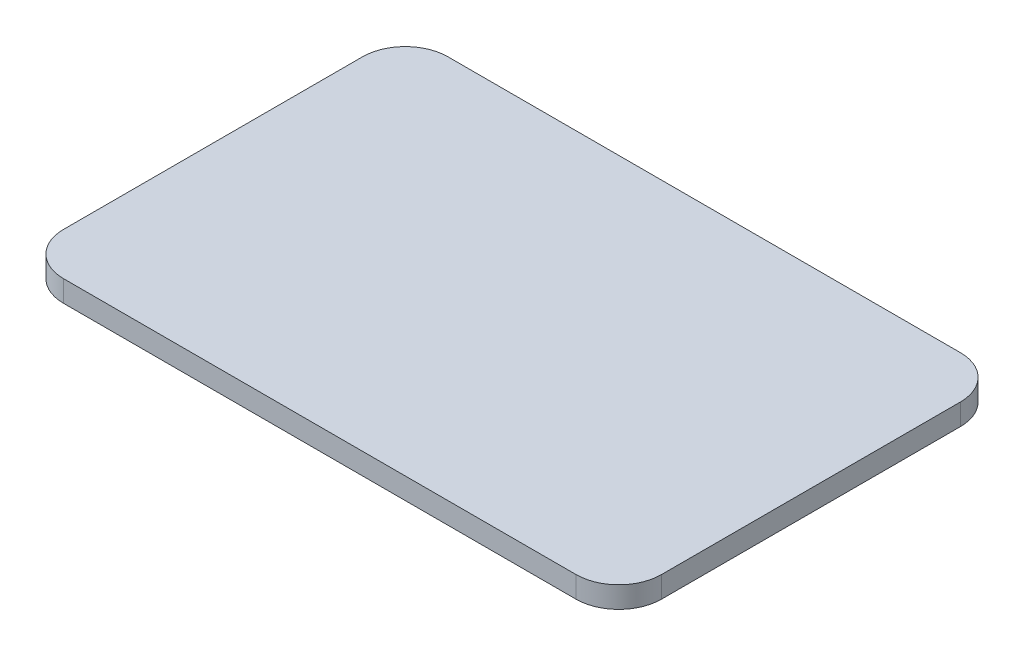
ISO-10303-21;
HEADER;
FILE_DESCRIPTION(('STEP AP214'),'2;1');
FILE_NAME('part.step','',(''),(''),'','','');
FILE_SCHEMA(('AUTOMOTIVE_DESIGN { 1 0 10303 214 1 1 1 1 }'));
ENDSEC;
DATA;
#1=APPLICATION_CONTEXT('core data for automotive mechanical design processes');
#2=APPLICATION_PROTOCOL_DEFINITION('international standard','automotive_design',2000,#1);
#3=PRODUCT_CONTEXT('',#1,'mechanical');
#4=PRODUCT('Part','Part','',(#3));
#5=PRODUCT_RELATED_PRODUCT_CATEGORY('part','',(#4));
#6=PRODUCT_DEFINITION_FORMATION('','',#4);
#7=PRODUCT_DEFINITION_CONTEXT('part definition',#1,'design');
#8=PRODUCT_DEFINITION('design','',#6,#7);
#9=PRODUCT_DEFINITION_SHAPE('','',#8);
#10=(LENGTH_UNIT() NAMED_UNIT(*) SI_UNIT(.MILLI.,.METRE.));
#11=(NAMED_UNIT(*) PLANE_ANGLE_UNIT() SI_UNIT($,.RADIAN.));
#12=(NAMED_UNIT(*) SI_UNIT($,.STERADIAN.) SOLID_ANGLE_UNIT());
#13=UNCERTAINTY_MEASURE_WITH_UNIT(LENGTH_MEASURE(1.E-05),#10,'distance_accuracy_value','');
#14=(GEOMETRIC_REPRESENTATION_CONTEXT(3) GLOBAL_UNCERTAINTY_ASSIGNED_CONTEXT((#13)) GLOBAL_UNIT_ASSIGNED_CONTEXT((#10,
#11,#12)) REPRESENTATION_CONTEXT('',''));
#15=CARTESIAN_POINT('',(0.,0.,0.));
#16=DIRECTION('',(0.,0.,1.));
#17=DIRECTION('',(1.,0.,0.));
#18=AXIS2_PLACEMENT_3D('',#15,#16,#17);
#19=CARTESIAN_POINT('',(-50.1375515818432,5.,-51.0660247592847));
#20=DIRECTION('',(1.,0.,0.));
#21=DIRECTION('',(0.,0.,-1.));
#22=AXIS2_PLACEMENT_3D('',#19,#20,#21);
#23=PLANE('',#22);
#24=DIRECTION('',(0.,0.,1.));
#25=VECTOR('',#24,1.);
#26=CARTESIAN_POINT('',(-50.1375515818432,5.,-51.0660247592847));
#27=LINE('',#26,#25);
#28=CARTESIAN_POINT('',(-50.1375515818432,5.,-41.0660247592847));
#29=VERTEX_POINT('',#28);
#30=CARTESIAN_POINT('',(-50.1375515818432,5.,28.9339752407152));
#31=VERTEX_POINT('',#30);
#32=EDGE_CURVE('E123',#29,#31,#27,.T.);
#33=ORIENTED_EDGE('',*,*,#32,.F.);
#34=DIRECTION('',(0.,-1.,0.));
#35=VECTOR('',#34,1.);
#36=CARTESIAN_POINT('',(-50.1375515818432,5.,-41.0660247592847));
#37=LINE('',#36,#35);
#38=CARTESIAN_POINT('',(-50.1375515818432,0.,-41.0660247592847));
#39=VERTEX_POINT('',#38);
#40=EDGE_CURVE('E108',#29,#39,#37,.T.);
#41=ORIENTED_EDGE('',*,*,#40,.T.);
#42=DIRECTION('',(0.,0.,1.));
#43=VECTOR('',#42,1.);
#44=CARTESIAN_POINT('',(-50.1375515818432,0.,-51.0660247592847));
#45=LINE('',#44,#43);
#46=CARTESIAN_POINT('',(-50.1375515818432,0.,28.9339752407152));
#47=VERTEX_POINT('',#46);
#48=EDGE_CURVE('E120',#39,#47,#45,.T.);
#49=ORIENTED_EDGE('',*,*,#48,.T.);
#50=DIRECTION('',(0.,-1.,0.));
#51=VECTOR('',#50,1.);
#52=CARTESIAN_POINT('',(-50.1375515818432,5.,28.9339752407153));
#53=LINE('',#52,#51);
#54=EDGE_CURVE('E125',#47,#31,#53,.F.);
#55=ORIENTED_EDGE('',*,*,#54,.T.);
#56=EDGE_LOOP('',(#33,#41,#49,#55));
#57=FACE_BOUND('',#56,.T.);
#58=ADVANCED_FACE('F38',(#57),#23,.F.);
#59=CARTESIAN_POINT('',(-50.1375515818432,5.,38.9339752407153));
#60=DIRECTION('',(0.,0.,-1.));
#61=DIRECTION('',(-1.,0.,0.));
#62=AXIS2_PLACEMENT_3D('',#59,#60,#61);
#63=PLANE('',#62);
#64=DIRECTION('',(1.,0.,0.));
#65=VECTOR('',#64,1.);
#66=CARTESIAN_POINT('',(-50.1375515818432,0.,38.9339752407153));
#67=LINE('',#66,#65);
#68=CARTESIAN_POINT('',(-40.1375515818432,0.,38.9339752407153));
#69=VERTEX_POINT('',#68);
#70=CARTESIAN_POINT('',(79.8624484181568,0.,38.9339752407153));
#71=VERTEX_POINT('',#70);
#72=EDGE_CURVE('E130',#69,#71,#67,.T.);
#73=ORIENTED_EDGE('',*,*,#72,.T.);
#74=DIRECTION('',(0.,-1.,0.));
#75=VECTOR('',#74,1.);
#76=CARTESIAN_POINT('',(79.8624484181568,5.,38.9339752407153));
#77=LINE('',#76,#75);
#78=CARTESIAN_POINT('',(79.8624484181568,5.,38.9339752407153));
#79=VERTEX_POINT('',#78);
#80=EDGE_CURVE('E11',#71,#79,#77,.F.);
#81=ORIENTED_EDGE('',*,*,#80,.T.);
#82=DIRECTION('',(1.,0.,0.));
#83=VECTOR('',#82,1.);
#84=CARTESIAN_POINT('',(-50.1375515818432,5.,38.9339752407153));
#85=LINE('',#84,#83);
#86=CARTESIAN_POINT('',(-40.1375515818432,5.,38.9339752407153));
#87=VERTEX_POINT('',#86);
#88=EDGE_CURVE('E165',#87,#79,#85,.T.);
#89=ORIENTED_EDGE('',*,*,#88,.F.);
#90=DIRECTION('',(0.,-1.,0.));
#91=VECTOR('',#90,1.);
#92=CARTESIAN_POINT('',(-40.1375515818432,5.,38.9339752407153));
#93=LINE('',#92,#91);
#94=EDGE_CURVE('E46',#87,#69,#93,.T.);
#95=ORIENTED_EDGE('',*,*,#94,.T.);
#96=EDGE_LOOP('',(#73,#81,#89,#95));
#97=FACE_BOUND('',#96,.T.);
#98=ADVANCED_FACE('F163',(#97),#63,.F.);
#99=CARTESIAN_POINT('',(89.8624484181568,5.,-51.0660247592847));
#100=DIRECTION('',(-1.,0.,0.));
#101=DIRECTION('',(0.,0.,1.));
#102=AXIS2_PLACEMENT_3D('',#99,#100,#101);
#103=PLANE('',#102);
#104=DIRECTION('',(0.,0.,-1.));
#105=VECTOR('',#104,1.);
#106=CARTESIAN_POINT('',(89.8624484181568,5.,-51.0660247592847));
#107=LINE('',#106,#105);
#108=CARTESIAN_POINT('',(89.8624484181568,5.,28.9339752407152));
#109=VERTEX_POINT('',#108);
#110=CARTESIAN_POINT('',(89.8624484181568,5.,-41.0660247592847));
#111=VERTEX_POINT('',#110);
#112=EDGE_CURVE('E173',#109,#111,#107,.T.);
#113=ORIENTED_EDGE('',*,*,#112,.F.);
#114=DIRECTION('',(0.,-1.,0.));
#115=VECTOR('',#114,1.);
#116=CARTESIAN_POINT('',(89.8624484181568,5.,28.9339752407153));
#117=LINE('',#116,#115);
#118=CARTESIAN_POINT('',(89.8624484181568,0.,28.9339752407152));
#119=VERTEX_POINT('',#118);
#120=EDGE_CURVE('E157',#109,#119,#117,.T.);
#121=ORIENTED_EDGE('',*,*,#120,.T.);
#122=DIRECTION('',(0.,0.,-1.));
#123=VECTOR('',#122,1.);
#124=CARTESIAN_POINT('',(89.8624484181568,0.,-51.0660247592847));
#125=LINE('',#124,#123);
#126=CARTESIAN_POINT('',(89.8624484181568,0.,-41.0660247592847));
#127=VERTEX_POINT('',#126);
#128=EDGE_CURVE('E133',#119,#127,#125,.T.);
#129=ORIENTED_EDGE('',*,*,#128,.T.);
#130=DIRECTION('',(0.,-1.,0.));
#131=VECTOR('',#130,1.);
#132=CARTESIAN_POINT('',(89.8624484181568,5.,-41.0660247592847));
#133=LINE('',#132,#131);
#134=EDGE_CURVE('E53',#127,#111,#133,.F.);
#135=ORIENTED_EDGE('',*,*,#134,.T.);
#136=EDGE_LOOP('',(#113,#121,#129,#135));
#137=FACE_BOUND('',#136,.T.);
#138=ADVANCED_FACE('F172',(#137),#103,.F.);
#139=CARTESIAN_POINT('',(-50.1375515818432,5.,-51.0660247592847));
#140=DIRECTION('',(0.,0.,1.));
#141=DIRECTION('',(1.,0.,0.));
#142=AXIS2_PLACEMENT_3D('',#139,#140,#141);
#143=PLANE('',#142);
#144=DIRECTION('',(-1.,0.,0.));
#145=VECTOR('',#144,1.);
#146=CARTESIAN_POINT('',(-50.1375515818432,0.,-51.0660247592847));
#147=LINE('',#146,#145);
#148=CARTESIAN_POINT('',(79.8624484181568,0.,-51.0660247592847));
#149=VERTEX_POINT('',#148);
#150=CARTESIAN_POINT('',(-40.1375515818432,0.,-51.0660247592847));
#151=VERTEX_POINT('',#150);
#152=EDGE_CURVE('E140',#149,#151,#147,.T.);
#153=ORIENTED_EDGE('',*,*,#152,.T.);
#154=DIRECTION('',(0.,-1.,0.));
#155=VECTOR('',#154,1.);
#156=CARTESIAN_POINT('',(-40.1375515818432,5.,-51.0660247592847));
#157=LINE('',#156,#155);
#158=CARTESIAN_POINT('',(-40.1375515818432,5.,-51.0660247592847));
#159=VERTEX_POINT('',#158);
#160=EDGE_CURVE('E109',#151,#159,#157,.F.);
#161=ORIENTED_EDGE('',*,*,#160,.T.);
#162=DIRECTION('',(-1.,0.,0.));
#163=VECTOR('',#162,1.);
#164=CARTESIAN_POINT('',(-50.1375515818432,5.,-51.0660247592847));
#165=LINE('',#164,#163);
#166=CARTESIAN_POINT('',(79.8624484181568,5.,-51.0660247592847));
#167=VERTEX_POINT('',#166);
#168=EDGE_CURVE('E136',#167,#159,#165,.T.);
#169=ORIENTED_EDGE('',*,*,#168,.F.);
#170=DIRECTION('',(0.,-1.,0.));
#171=VECTOR('',#170,1.);
#172=CARTESIAN_POINT('',(79.8624484181568,5.,-51.0660247592847));
#173=LINE('',#172,#171);
#174=EDGE_CURVE('E114',#167,#149,#173,.T.);
#175=ORIENTED_EDGE('',*,*,#174,.T.);
#176=EDGE_LOOP('',(#153,#161,#169,#175));
#177=FACE_BOUND('',#176,.T.);
#178=ADVANCED_FACE('F203',(#177),#143,.F.);
#179=CARTESIAN_POINT('',(0.,5.,0.));
#180=DIRECTION('',(0.,1.,0.));
#181=DIRECTION('',(0.,0.,1.));
#182=AXIS2_PLACEMENT_3D('',#179,#180,#181);
#183=PLANE('',#182);
#184=ORIENTED_EDGE('',*,*,#168,.T.);
#185=CARTESIAN_POINT('',(-40.1375515818432,5.,-41.0660247592847));
#186=DIRECTION('',(0.,1.,0.));
#187=DIRECTION('',(0.,0.,1.));
#188=AXIS2_PLACEMENT_3D('',#185,#186,#187);
#189=CIRCLE('',#188,10.);
#190=EDGE_CURVE('E154',#159,#29,#189,.T.);
#191=ORIENTED_EDGE('',*,*,#190,.T.);
#192=ORIENTED_EDGE('',*,*,#32,.T.);
#193=CARTESIAN_POINT('',(-40.1375515818432,5.,28.9339752407153));
#194=DIRECTION('',(0.,1.,0.));
#195=DIRECTION('',(0.,0.,1.));
#196=AXIS2_PLACEMENT_3D('',#193,#194,#195);
#197=CIRCLE('',#196,10.);
#198=EDGE_CURVE('E151',#31,#87,#197,.T.);
#199=ORIENTED_EDGE('',*,*,#198,.T.);
#200=ORIENTED_EDGE('',*,*,#88,.T.);
#201=CARTESIAN_POINT('',(79.8624484181568,5.,28.9339752407153));
#202=DIRECTION('',(0.,1.,0.));
#203=DIRECTION('',(0.,0.,1.));
#204=AXIS2_PLACEMENT_3D('',#201,#202,#203);
#205=CIRCLE('',#204,10.);
#206=EDGE_CURVE('E60',#79,#109,#205,.T.);
#207=ORIENTED_EDGE('',*,*,#206,.T.);
#208=ORIENTED_EDGE('',*,*,#112,.T.);
#209=CARTESIAN_POINT('',(79.8624484181568,5.,-41.0660247592847));
#210=DIRECTION('',(0.,1.,0.));
#211=DIRECTION('',(0.,0.,1.));
#212=AXIS2_PLACEMENT_3D('',#209,#210,#211);
#213=CIRCLE('',#212,10.);
#214=EDGE_CURVE('E149',#111,#167,#213,.T.);
#215=ORIENTED_EDGE('',*,*,#214,.T.);
#216=EDGE_LOOP('',(#184,#191,#192,#199,#200,#207,#208,#215));
#217=FACE_BOUND('',#216,.T.);
#218=ADVANCED_FACE('F178',(#217),#183,.T.);
#219=CARTESIAN_POINT('',(0.,0.,0.));
#220=DIRECTION('',(0.,1.,0.));
#221=DIRECTION('',(0.,0.,1.));
#222=AXIS2_PLACEMENT_3D('',#219,#220,#221);
#223=PLANE('',#222);
#224=ORIENTED_EDGE('',*,*,#48,.F.);
#225=CARTESIAN_POINT('',(-40.1375515818432,0.,-41.0660247592847));
#226=DIRECTION('',(0.,1.,0.));
#227=DIRECTION('',(0.,0.,1.));
#228=AXIS2_PLACEMENT_3D('',#225,#226,#227);
#229=CIRCLE('',#228,10.);
#230=EDGE_CURVE('E104',#39,#151,#229,.F.);
#231=ORIENTED_EDGE('',*,*,#230,.T.);
#232=ORIENTED_EDGE('',*,*,#152,.F.);
#233=CARTESIAN_POINT('',(79.8624484181568,0.,-41.0660247592847));
#234=DIRECTION('',(0.,1.,0.));
#235=DIRECTION('',(0.,0.,1.));
#236=AXIS2_PLACEMENT_3D('',#233,#234,#235);
#237=CIRCLE('',#236,10.);
#238=EDGE_CURVE('E124',#149,#127,#237,.F.);
#239=ORIENTED_EDGE('',*,*,#238,.T.);
#240=ORIENTED_EDGE('',*,*,#128,.F.);
#241=CARTESIAN_POINT('',(79.8624484181568,0.,28.9339752407153));
#242=DIRECTION('',(0.,1.,0.));
#243=DIRECTION('',(0.,0.,1.));
#244=AXIS2_PLACEMENT_3D('',#241,#242,#243);
#245=CIRCLE('',#244,10.);
#246=EDGE_CURVE('E115',#119,#71,#245,.F.);
#247=ORIENTED_EDGE('',*,*,#246,.T.);
#248=ORIENTED_EDGE('',*,*,#72,.F.);
#249=CARTESIAN_POINT('',(-40.1375515818432,0.,28.9339752407153));
#250=DIRECTION('',(0.,1.,0.));
#251=DIRECTION('',(0.,0.,1.));
#252=AXIS2_PLACEMENT_3D('',#249,#250,#251);
#253=CIRCLE('',#252,10.);
#254=EDGE_CURVE('E129',#69,#47,#253,.F.);
#255=ORIENTED_EDGE('',*,*,#254,.T.);
#256=EDGE_LOOP('',(#224,#231,#232,#239,#240,#247,#248,#255));
#257=FACE_BOUND('',#256,.T.);
#258=ADVANCED_FACE('F127',(#257),#223,.F.);
#259=CARTESIAN_POINT('',(-40.1375515818432,5.,-41.0660247592847));
#260=DIRECTION('',(0.,-1.,0.));
#261=DIRECTION('',(0.,0.,-1.));
#262=AXIS2_PLACEMENT_3D('',#259,#260,#261);
#263=CYLINDRICAL_SURFACE('',#262,10.);
#264=ORIENTED_EDGE('',*,*,#190,.F.);
#265=ORIENTED_EDGE('',*,*,#160,.F.);
#266=ORIENTED_EDGE('',*,*,#230,.F.);
#267=ORIENTED_EDGE('',*,*,#40,.F.);
#268=EDGE_LOOP('',(#264,#265,#266,#267));
#269=FACE_BOUND('',#268,.T.);
#270=ADVANCED_FACE('F107',(#269),#263,.T.);
#271=CARTESIAN_POINT('',(79.8624484181568,5.,28.9339752407153));
#272=DIRECTION('',(0.,-1.,0.));
#273=DIRECTION('',(0.,0.,-1.));
#274=AXIS2_PLACEMENT_3D('',#271,#272,#273);
#275=CYLINDRICAL_SURFACE('',#274,10.);
#276=ORIENTED_EDGE('',*,*,#206,.F.);
#277=ORIENTED_EDGE('',*,*,#80,.F.);
#278=ORIENTED_EDGE('',*,*,#246,.F.);
#279=ORIENTED_EDGE('',*,*,#120,.F.);
#280=EDGE_LOOP('',(#276,#277,#278,#279));
#281=FACE_BOUND('',#280,.T.);
#282=ADVANCED_FACE('F171',(#281),#275,.T.);
#283=CARTESIAN_POINT('',(-40.1375515818432,5.,28.9339752407153));
#284=DIRECTION('',(0.,-1.,0.));
#285=DIRECTION('',(0.,0.,-1.));
#286=AXIS2_PLACEMENT_3D('',#283,#284,#285);
#287=CYLINDRICAL_SURFACE('',#286,10.);
#288=ORIENTED_EDGE('',*,*,#198,.F.);
#289=ORIENTED_EDGE('',*,*,#54,.F.);
#290=ORIENTED_EDGE('',*,*,#254,.F.);
#291=ORIENTED_EDGE('',*,*,#94,.F.);
#292=EDGE_LOOP('',(#288,#289,#290,#291));
#293=FACE_BOUND('',#292,.T.);
#294=ADVANCED_FACE('F179',(#293),#287,.T.);
#295=CARTESIAN_POINT('',(79.8624484181568,5.,-41.0660247592847));
#296=DIRECTION('',(0.,-1.,0.));
#297=DIRECTION('',(0.,0.,-1.));
#298=AXIS2_PLACEMENT_3D('',#295,#296,#297);
#299=CYLINDRICAL_SURFACE('',#298,10.);
#300=ORIENTED_EDGE('',*,*,#214,.F.);
#301=ORIENTED_EDGE('',*,*,#134,.F.);
#302=ORIENTED_EDGE('',*,*,#238,.F.);
#303=ORIENTED_EDGE('',*,*,#174,.F.);
#304=EDGE_LOOP('',(#300,#301,#302,#303));
#305=FACE_BOUND('',#304,.T.);
#306=ADVANCED_FACE('F40',(#305),#299,.T.);
#307=CLOSED_SHELL('',(#58,#98,#138,#178,#218,#258,#270,#282,#294,#306));
#308=MANIFOLD_SOLID_BREP('B2',#307);
#309=ADVANCED_BREP_SHAPE_REPRESENTATION('',(#18,#308),#14);
#310=SHAPE_DEFINITION_REPRESENTATION(#9,#309);
ENDSEC;
END-ISO-10303-21;
